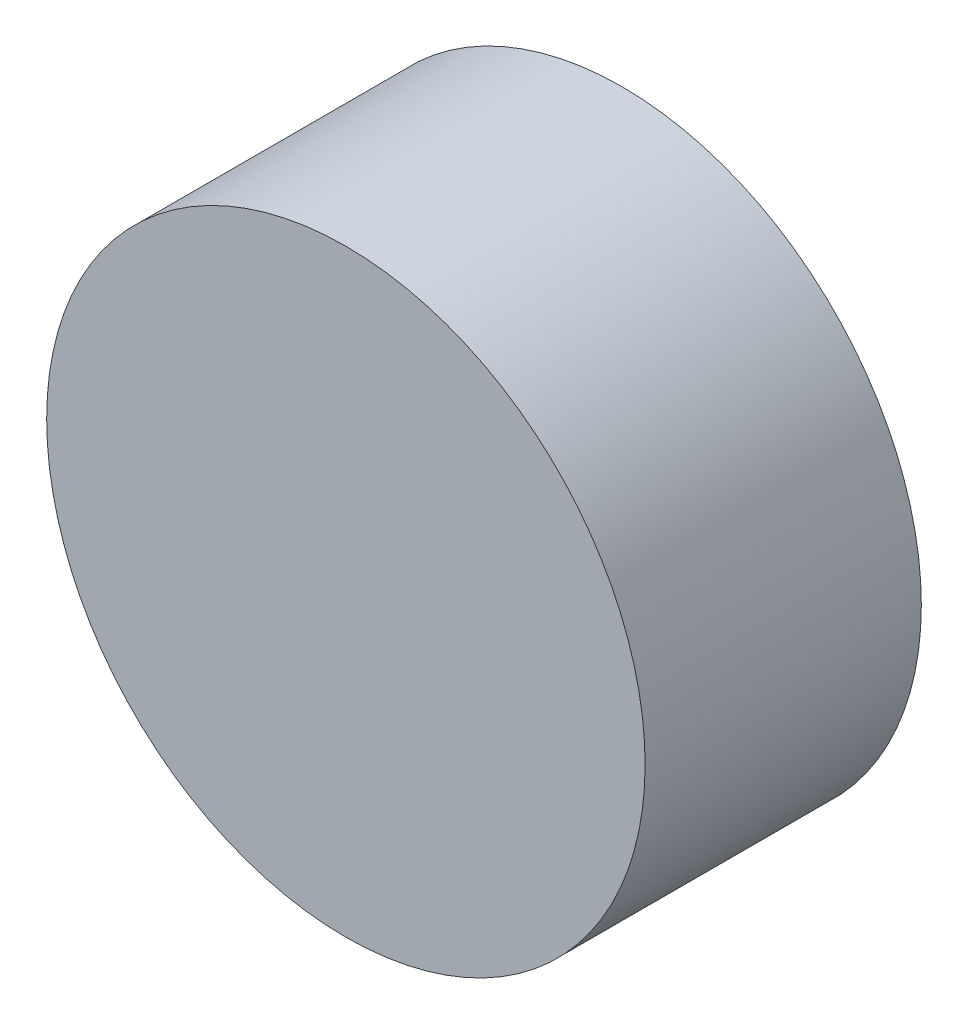
ISO-10303-21;
HEADER;
FILE_DESCRIPTION(('STEP AP214'),'2;1');
FILE_NAME('part.step','',(''),(''),'','','');
FILE_SCHEMA(('AUTOMOTIVE_DESIGN { 1 0 10303 214 1 1 1 1 }'));
ENDSEC;
DATA;
#1=APPLICATION_CONTEXT('core data for automotive mechanical design processes');
#2=APPLICATION_PROTOCOL_DEFINITION('international standard','automotive_design',2000,#1);
#3=PRODUCT_CONTEXT('',#1,'mechanical');
#4=PRODUCT('Part','Part','',(#3));
#5=PRODUCT_RELATED_PRODUCT_CATEGORY('part','',(#4));
#6=PRODUCT_DEFINITION_FORMATION('','',#4);
#7=PRODUCT_DEFINITION_CONTEXT('part definition',#1,'design');
#8=PRODUCT_DEFINITION('design','',#6,#7);
#9=PRODUCT_DEFINITION_SHAPE('','',#8);
#10=(LENGTH_UNIT() NAMED_UNIT(*) SI_UNIT(.MILLI.,.METRE.));
#11=(NAMED_UNIT(*) PLANE_ANGLE_UNIT() SI_UNIT($,.RADIAN.));
#12=(NAMED_UNIT(*) SI_UNIT($,.STERADIAN.) SOLID_ANGLE_UNIT());
#13=UNCERTAINTY_MEASURE_WITH_UNIT(LENGTH_MEASURE(1.E-05),#10,'distance_accuracy_value','');
#14=(GEOMETRIC_REPRESENTATION_CONTEXT(3) GLOBAL_UNCERTAINTY_ASSIGNED_CONTEXT((#13)) GLOBAL_UNIT_ASSIGNED_CONTEXT((#10,
#11,#12)) REPRESENTATION_CONTEXT('',''));
#15=CARTESIAN_POINT('',(0.,0.,0.));
#16=DIRECTION('',(0.,0.,1.));
#17=DIRECTION('',(1.,0.,0.));
#18=AXIS2_PLACEMENT_3D('',#15,#16,#17);
#19=CARTESIAN_POINT('',(0.,0.,60.));
#20=DIRECTION('',(0.,0.,-1.));
#21=DIRECTION('',(-1.,0.,0.));
#22=AXIS2_PLACEMENT_3D('',#19,#20,#21);
#23=CYLINDRICAL_SURFACE('',#22,65.);
#24=CARTESIAN_POINT('',(0.,0.,60.));
#25=DIRECTION('',(0.,0.,1.));
#26=DIRECTION('',(1.,0.,0.));
#27=AXIS2_PLACEMENT_3D('',#24,#25,#26);
#28=CIRCLE('',#27,65.);
#29=CARTESIAN_POINT('',(65.,0.,60.));
#30=VERTEX_POINT('',#29);
#31=EDGE_CURVE('E10',#30,#30,#28,.T.);
#32=ORIENTED_EDGE('',*,*,#31,.F.);
#33=EDGE_LOOP('',(#32));
#34=FACE_BOUND('',#33,.T.);
#35=CARTESIAN_POINT('',(0.,0.,0.));
#36=DIRECTION('',(0.,0.,1.));
#37=DIRECTION('',(1.,0.,0.));
#38=AXIS2_PLACEMENT_3D('',#35,#36,#37);
#39=CIRCLE('',#38,65.);
#40=CARTESIAN_POINT('',(65.,0.,0.));
#41=VERTEX_POINT('',#40);
#42=EDGE_CURVE('E32',#41,#41,#39,.T.);
#43=ORIENTED_EDGE('',*,*,#42,.T.);
#44=EDGE_LOOP('',(#43));
#45=FACE_BOUND('',#44,.T.);
#46=ADVANCED_FACE('F29',(#34,#45),#23,.T.);
#47=CARTESIAN_POINT('',(0.,0.,60.));
#48=DIRECTION('',(0.,0.,1.));
#49=DIRECTION('',(1.,0.,0.));
#50=AXIS2_PLACEMENT_3D('',#47,#48,#49);
#51=PLANE('',#50);
#52=ORIENTED_EDGE('',*,*,#31,.T.);
#53=EDGE_LOOP('',(#52));
#54=FACE_BOUND('',#53,.T.);
#55=ADVANCED_FACE('F44',(#54),#51,.T.);
#56=CARTESIAN_POINT('',(0.,0.,0.));
#57=DIRECTION('',(0.,0.,1.));
#58=DIRECTION('',(1.,0.,0.));
#59=AXIS2_PLACEMENT_3D('',#56,#57,#58);
#60=PLANE('',#59);
#61=ORIENTED_EDGE('',*,*,#42,.F.);
#62=EDGE_LOOP('',(#61));
#63=FACE_BOUND('',#62,.T.);
#64=ADVANCED_FACE('F42',(#63),#60,.F.);
#65=CLOSED_SHELL('',(#46,#55,#64));
#66=MANIFOLD_SOLID_BREP('B2',#65);
#67=ADVANCED_BREP_SHAPE_REPRESENTATION('',(#18,#66),#14);
#68=SHAPE_DEFINITION_REPRESENTATION(#9,#67);
ENDSEC;
END-ISO-10303-21;
